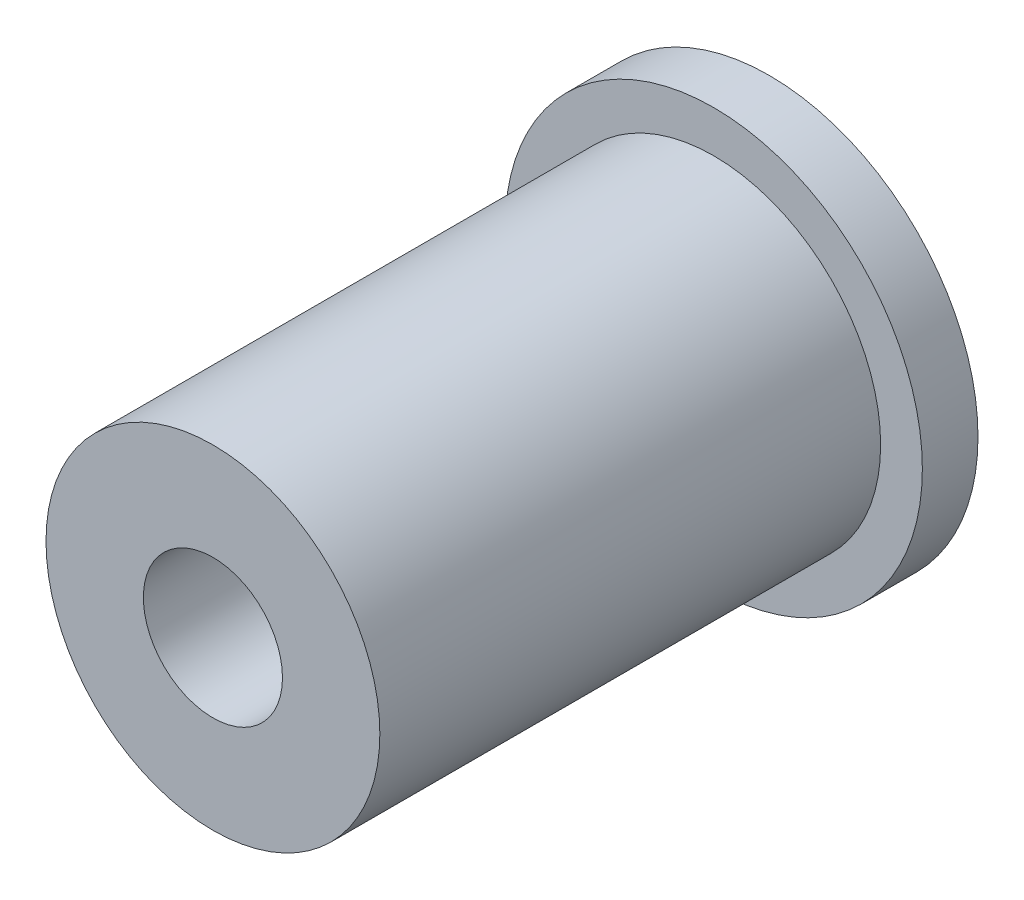
ISO-10303-21;
HEADER;
FILE_DESCRIPTION(('STEP AP214'),'2;1');
FILE_NAME('part.step','',(''),(''),'','','');
FILE_SCHEMA(('AUTOMOTIVE_DESIGN { 1 0 10303 214 1 1 1 1 }'));
ENDSEC;
DATA;
#1=APPLICATION_CONTEXT('core data for automotive mechanical design processes');
#2=APPLICATION_PROTOCOL_DEFINITION('international standard','automotive_design',2000,#1);
#3=PRODUCT_CONTEXT('',#1,'mechanical');
#4=PRODUCT('Part','Part','',(#3));
#5=PRODUCT_RELATED_PRODUCT_CATEGORY('part','',(#4));
#6=PRODUCT_DEFINITION_FORMATION('','',#4);
#7=PRODUCT_DEFINITION_CONTEXT('part definition',#1,'design');
#8=PRODUCT_DEFINITION('design','',#6,#7);
#9=PRODUCT_DEFINITION_SHAPE('','',#8);
#10=(LENGTH_UNIT() NAMED_UNIT(*) SI_UNIT(.MILLI.,.METRE.));
#11=(NAMED_UNIT(*) PLANE_ANGLE_UNIT() SI_UNIT($,.RADIAN.));
#12=(NAMED_UNIT(*) SI_UNIT($,.STERADIAN.) SOLID_ANGLE_UNIT());
#13=UNCERTAINTY_MEASURE_WITH_UNIT(LENGTH_MEASURE(1.E-05),#10,'distance_accuracy_value','');
#14=(GEOMETRIC_REPRESENTATION_CONTEXT(3) GLOBAL_UNCERTAINTY_ASSIGNED_CONTEXT((#13)) GLOBAL_UNIT_ASSIGNED_CONTEXT((#10,
#11,#12)) REPRESENTATION_CONTEXT('',''));
#15=CARTESIAN_POINT('',(0.,0.,0.));
#16=DIRECTION('',(0.,0.,1.));
#17=DIRECTION('',(1.,0.,0.));
#18=AXIS2_PLACEMENT_3D('',#15,#16,#17);
#19=CARTESIAN_POINT('',(0.,0.,2.));
#20=DIRECTION('',(0.,0.,1.));
#21=DIRECTION('',(1.,0.,0.));
#22=AXIS2_PLACEMENT_3D('',#19,#20,#21);
#23=PLANE('',#22);
#24=CARTESIAN_POINT('',(0.,0.,2.));
#25=DIRECTION('',(0.,0.,1.));
#26=DIRECTION('',(1.,0.,0.));
#27=AXIS2_PLACEMENT_3D('',#24,#25,#26);
#28=CIRCLE('',#27,6.);
#29=CARTESIAN_POINT('',(6.,0.,2.));
#30=VERTEX_POINT('',#29);
#31=EDGE_CURVE('E10',#30,#30,#28,.T.);
#32=ORIENTED_EDGE('',*,*,#31,.F.);
#33=EDGE_LOOP('',(#32));
#34=FACE_BOUND('',#33,.T.);
#35=CARTESIAN_POINT('',(0.,0.,2.));
#36=DIRECTION('',(0.,0.,1.));
#37=DIRECTION('',(1.,0.,0.));
#38=AXIS2_PLACEMENT_3D('',#35,#36,#37);
#39=CIRCLE('',#38,7.5);
#40=CARTESIAN_POINT('',(7.5,0.,2.));
#41=VERTEX_POINT('',#40);
#42=EDGE_CURVE('E46',#41,#41,#39,.T.);
#43=ORIENTED_EDGE('',*,*,#42,.T.);
#44=EDGE_LOOP('',(#43));
#45=FACE_BOUND('',#44,.T.);
#46=ADVANCED_FACE('F37',(#34,#45),#23,.T.);
#47=CARTESIAN_POINT('',(0.,0.,0.));
#48=DIRECTION('',(0.,0.,1.));
#49=DIRECTION('',(1.,0.,0.));
#50=AXIS2_PLACEMENT_3D('',#47,#48,#49);
#51=PLANE('',#50);
#52=CARTESIAN_POINT('',(0.,0.,0.));
#53=DIRECTION('',(0.,0.,1.));
#54=DIRECTION('',(1.,0.,0.));
#55=AXIS2_PLACEMENT_3D('',#52,#53,#54);
#56=CIRCLE('',#55,7.5);
#57=CARTESIAN_POINT('',(7.5,0.,0.));
#58=VERTEX_POINT('',#57);
#59=EDGE_CURVE('E41',#58,#58,#56,.T.);
#60=ORIENTED_EDGE('',*,*,#59,.F.);
#61=EDGE_LOOP('',(#60));
#62=FACE_BOUND('',#61,.T.);
#63=CARTESIAN_POINT('',(0.,0.,0.));
#64=DIRECTION('',(0.,0.,1.));
#65=DIRECTION('',(1.,0.,0.));
#66=AXIS2_PLACEMENT_3D('',#63,#64,#65);
#67=CIRCLE('',#66,2.5);
#68=CARTESIAN_POINT('',(2.5,0.,0.));
#69=VERTEX_POINT('',#68);
#70=EDGE_CURVE('E56',#69,#69,#67,.T.);
#71=ORIENTED_EDGE('',*,*,#70,.T.);
#72=EDGE_LOOP('',(#71));
#73=FACE_BOUND('',#72,.T.);
#74=ADVANCED_FACE('F87',(#62,#73),#51,.F.);
#75=CARTESIAN_POINT('',(0.,0.,2.));
#76=DIRECTION('',(0.,0.,-1.));
#77=DIRECTION('',(-1.,0.,0.));
#78=AXIS2_PLACEMENT_3D('',#75,#76,#77);
#79=CYLINDRICAL_SURFACE('',#78,7.5);
#80=ORIENTED_EDGE('',*,*,#42,.F.);
#81=EDGE_LOOP('',(#80));
#82=FACE_BOUND('',#81,.T.);
#83=ORIENTED_EDGE('',*,*,#59,.T.);
#84=EDGE_LOOP('',(#83));
#85=FACE_BOUND('',#84,.T.);
#86=ADVANCED_FACE('F39',(#82,#85),#79,.T.);
#87=CARTESIAN_POINT('',(0.,0.,2.));
#88=DIRECTION('',(0.,0.,-1.));
#89=DIRECTION('',(-1.,0.,0.));
#90=AXIS2_PLACEMENT_3D('',#87,#88,#89);
#91=CYLINDRICAL_SURFACE('',#90,2.5);
#92=ORIENTED_EDGE('',*,*,#70,.F.);
#93=EDGE_LOOP('',(#92));
#94=FACE_BOUND('',#93,.T.);
#95=CARTESIAN_POINT('',(0.,0.,20.));
#96=DIRECTION('',(0.,0.,1.));
#97=DIRECTION('',(1.,0.,0.));
#98=AXIS2_PLACEMENT_3D('',#95,#96,#97);
#99=CIRCLE('',#98,2.5);
#100=CARTESIAN_POINT('',(2.5,0.,20.));
#101=VERTEX_POINT('',#100);
#102=EDGE_CURVE('E65',#101,#101,#99,.T.);
#103=ORIENTED_EDGE('',*,*,#102,.T.);
#104=EDGE_LOOP('',(#103));
#105=FACE_BOUND('',#104,.T.);
#106=ADVANCED_FACE('F72',(#94,#105),#91,.F.);
#107=CARTESIAN_POINT('',(0.,0.,20.));
#108=DIRECTION('',(0.,0.,1.));
#109=DIRECTION('',(1.,0.,0.));
#110=AXIS2_PLACEMENT_3D('',#107,#108,#109);
#111=PLANE('',#110);
#112=CARTESIAN_POINT('',(0.,0.,20.));
#113=DIRECTION('',(0.,0.,1.));
#114=DIRECTION('',(1.,0.,0.));
#115=AXIS2_PLACEMENT_3D('',#112,#113,#114);
#116=CIRCLE('',#115,6.);
#117=CARTESIAN_POINT('',(6.,0.,20.));
#118=VERTEX_POINT('',#117);
#119=EDGE_CURVE('E54',#118,#118,#116,.T.);
#120=ORIENTED_EDGE('',*,*,#119,.T.);
#121=EDGE_LOOP('',(#120));
#122=FACE_BOUND('',#121,.T.);
#123=ORIENTED_EDGE('',*,*,#102,.F.);
#124=EDGE_LOOP('',(#123));
#125=FACE_BOUND('',#124,.T.);
#126=ADVANCED_FACE('F74',(#122,#125),#111,.T.);
#127=CARTESIAN_POINT('',(0.,0.,20.));
#128=DIRECTION('',(0.,0.,-1.));
#129=DIRECTION('',(-1.,0.,0.));
#130=AXIS2_PLACEMENT_3D('',#127,#128,#129);
#131=CYLINDRICAL_SURFACE('',#130,6.);
#132=ORIENTED_EDGE('',*,*,#119,.F.);
#133=EDGE_LOOP('',(#132));
#134=FACE_BOUND('',#133,.T.);
#135=ORIENTED_EDGE('',*,*,#31,.T.);
#136=EDGE_LOOP('',(#135));
#137=FACE_BOUND('',#136,.T.);
#138=ADVANCED_FACE('F76',(#134,#137),#131,.T.);
#139=CLOSED_SHELL('',(#46,#74,#86,#106,#126,#138));
#140=MANIFOLD_SOLID_BREP('B2',#139);
#141=ADVANCED_BREP_SHAPE_REPRESENTATION('',(#18,#140),#14);
#142=SHAPE_DEFINITION_REPRESENTATION(#9,#141);
ENDSEC;
END-ISO-10303-21;
